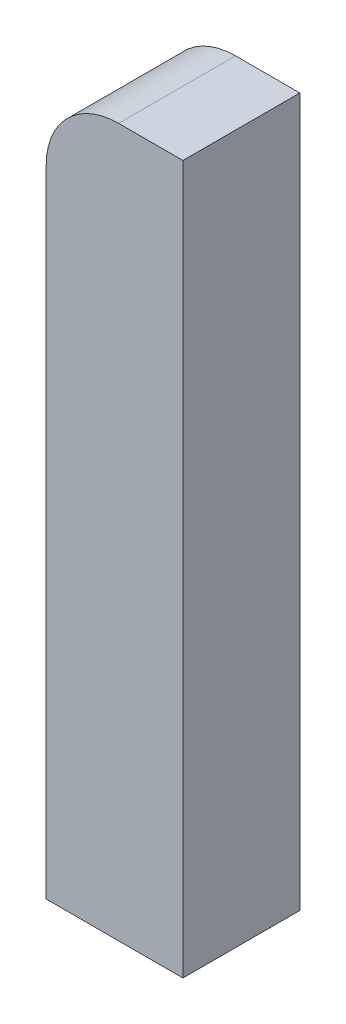
ISO-10303-21;
HEADER;
FILE_DESCRIPTION(('STEP AP214'),'2;1');
FILE_NAME('part.step','',(''),(''),'','','');
FILE_SCHEMA(('AUTOMOTIVE_DESIGN { 1 0 10303 214 1 1 1 1 }'));
ENDSEC;
DATA;
#1=APPLICATION_CONTEXT('core data for automotive mechanical design processes');
#2=APPLICATION_PROTOCOL_DEFINITION('international standard','automotive_design',2000,#1);
#3=PRODUCT_CONTEXT('',#1,'mechanical');
#4=PRODUCT('Part','Part','',(#3));
#5=PRODUCT_RELATED_PRODUCT_CATEGORY('part','',(#4));
#6=PRODUCT_DEFINITION_FORMATION('','',#4);
#7=PRODUCT_DEFINITION_CONTEXT('part definition',#1,'design');
#8=PRODUCT_DEFINITION('design','',#6,#7);
#9=PRODUCT_DEFINITION_SHAPE('','',#8);
#10=(LENGTH_UNIT() NAMED_UNIT(*) SI_UNIT(.MILLI.,.METRE.));
#11=(NAMED_UNIT(*) PLANE_ANGLE_UNIT() SI_UNIT($,.RADIAN.));
#12=(NAMED_UNIT(*) SI_UNIT($,.STERADIAN.) SOLID_ANGLE_UNIT());
#13=UNCERTAINTY_MEASURE_WITH_UNIT(LENGTH_MEASURE(1.E-05),#10,'distance_accuracy_value','');
#14=(GEOMETRIC_REPRESENTATION_CONTEXT(3) GLOBAL_UNCERTAINTY_ASSIGNED_CONTEXT((#13)) GLOBAL_UNIT_ASSIGNED_CONTEXT((#10,
#11,#12)) REPRESENTATION_CONTEXT('',''));
#15=CARTESIAN_POINT('',(0.,0.,0.));
#16=DIRECTION('',(0.,0.,1.));
#17=DIRECTION('',(1.,0.,0.));
#18=AXIS2_PLACEMENT_3D('',#15,#16,#17);
#19=CARTESIAN_POINT('',(0.,0.,16.141));
#20=DIRECTION('',(0.,0.,1.));
#21=DIRECTION('',(1.,0.,0.));
#22=AXIS2_PLACEMENT_3D('',#19,#20,#21);
#23=PLANE('',#22);
#24=DIRECTION('',(-1.,0.,0.));
#25=VECTOR('',#24,1.);
#26=CARTESIAN_POINT('',(28.3125,145.891,16.141));
#27=LINE('',#26,#25);
#28=CARTESIAN_POINT('',(28.3125,145.891,16.141));
#29=VERTEX_POINT('',#28);
#30=CARTESIAN_POINT('',(19.4375,145.891,16.141));
#31=VERTEX_POINT('',#30);
#32=EDGE_CURVE('E122',#29,#31,#27,.T.);
#33=ORIENTED_EDGE('',*,*,#32,.T.);
#34=CARTESIAN_POINT('',(19.4375,135.891,16.141));
#35=DIRECTION('',(0.,0.,1.));
#36=DIRECTION('',(1.,0.,0.));
#37=AXIS2_PLACEMENT_3D('',#34,#35,#36);
#38=CIRCLE('',#37,10.);
#39=CARTESIAN_POINT('',(9.4375,135.891,16.141));
#40=VERTEX_POINT('',#39);
#41=EDGE_CURVE('E11',#31,#40,#38,.T.);
#42=ORIENTED_EDGE('',*,*,#41,.T.);
#43=DIRECTION('',(0.,-1.,0.));
#44=VECTOR('',#43,1.);
#45=CARTESIAN_POINT('',(9.4375,145.891,16.141));
#46=LINE('',#45,#44);
#47=CARTESIAN_POINT('',(9.4375,48.144,16.141));
#48=VERTEX_POINT('',#47);
#49=EDGE_CURVE('E107',#40,#48,#46,.T.);
#50=ORIENTED_EDGE('',*,*,#49,.T.);
#51=DIRECTION('',(-1.,0.,0.));
#52=VECTOR('',#51,1.);
#53=CARTESIAN_POINT('',(9.4375,48.144,16.141));
#54=LINE('',#53,#52);
#55=CARTESIAN_POINT('',(28.3125,48.144,16.141));
#56=VERTEX_POINT('',#55);
#57=EDGE_CURVE('E90',#56,#48,#54,.T.);
#58=ORIENTED_EDGE('',*,*,#57,.F.);
#59=DIRECTION('',(0.,1.,0.));
#60=VECTOR('',#59,1.);
#61=CARTESIAN_POINT('',(28.3125,48.144,16.141));
#62=LINE('',#61,#60);
#63=EDGE_CURVE('E97',#56,#29,#62,.T.);
#64=ORIENTED_EDGE('',*,*,#63,.T.);
#65=EDGE_LOOP('',(#33,#42,#50,#58,#64));
#66=FACE_BOUND('',#65,.T.);
#67=ADVANCED_FACE('F33',(#66),#23,.T.);
#68=CARTESIAN_POINT('',(0.,0.,0.));
#69=DIRECTION('',(0.,0.,1.));
#70=DIRECTION('',(1.,0.,0.));
#71=AXIS2_PLACEMENT_3D('',#68,#69,#70);
#72=PLANE('',#71);
#73=DIRECTION('',(0.,-1.,0.));
#74=VECTOR('',#73,1.);
#75=CARTESIAN_POINT('',(9.4375,145.891,0.));
#76=LINE('',#75,#74);
#77=CARTESIAN_POINT('',(9.4375,135.891,0.));
#78=VERTEX_POINT('',#77);
#79=CARTESIAN_POINT('',(9.4375,48.144,0.));
#80=VERTEX_POINT('',#79);
#81=EDGE_CURVE('E104',#78,#80,#76,.T.);
#82=ORIENTED_EDGE('',*,*,#81,.F.);
#83=CARTESIAN_POINT('',(19.4375,135.891,0.));
#84=DIRECTION('',(0.,0.,1.));
#85=DIRECTION('',(1.,0.,0.));
#86=AXIS2_PLACEMENT_3D('',#83,#84,#85);
#87=CIRCLE('',#86,10.);
#88=CARTESIAN_POINT('',(19.4375,145.891,0.));
#89=VERTEX_POINT('',#88);
#90=EDGE_CURVE('E55',#78,#89,#87,.F.);
#91=ORIENTED_EDGE('',*,*,#90,.T.);
#92=DIRECTION('',(-1.,0.,0.));
#93=VECTOR('',#92,1.);
#94=CARTESIAN_POINT('',(28.3125,145.891,0.));
#95=LINE('',#94,#93);
#96=CARTESIAN_POINT('',(28.3125,145.891,0.));
#97=VERTEX_POINT('',#96);
#98=EDGE_CURVE('E102',#97,#89,#95,.T.);
#99=ORIENTED_EDGE('',*,*,#98,.F.);
#100=DIRECTION('',(0.,1.,0.));
#101=VECTOR('',#100,1.);
#102=CARTESIAN_POINT('',(28.3125,48.144,0.));
#103=LINE('',#102,#101);
#104=CARTESIAN_POINT('',(28.3125,48.144,0.));
#105=VERTEX_POINT('',#104);
#106=EDGE_CURVE('E89',#105,#97,#103,.T.);
#107=ORIENTED_EDGE('',*,*,#106,.F.);
#108=DIRECTION('',(-1.,0.,0.));
#109=VECTOR('',#108,1.);
#110=CARTESIAN_POINT('',(9.4375,48.144,0.));
#111=LINE('',#110,#109);
#112=EDGE_CURVE('E80',#105,#80,#111,.T.);
#113=ORIENTED_EDGE('',*,*,#112,.T.);
#114=EDGE_LOOP('',(#82,#91,#99,#107,#113));
#115=FACE_BOUND('',#114,.T.);
#116=ADVANCED_FACE('F101',(#115),#72,.F.);
#117=CARTESIAN_POINT('',(28.3125,48.144,16.141));
#118=DIRECTION('',(-1.,0.,0.));
#119=DIRECTION('',(0.,0.,1.));
#120=AXIS2_PLACEMENT_3D('',#117,#118,#119);
#121=PLANE('',#120);
#122=ORIENTED_EDGE('',*,*,#106,.T.);
#123=DIRECTION('',(0.,0.,-1.));
#124=VECTOR('',#123,1.);
#125=CARTESIAN_POINT('',(28.3125,145.891,16.141));
#126=LINE('',#125,#124);
#127=EDGE_CURVE('E99',#29,#97,#126,.T.);
#128=ORIENTED_EDGE('',*,*,#127,.F.);
#129=ORIENTED_EDGE('',*,*,#63,.F.);
#130=DIRECTION('',(0.,0.,-1.));
#131=VECTOR('',#130,1.);
#132=CARTESIAN_POINT('',(28.3125,48.144,16.141));
#133=LINE('',#132,#131);
#134=EDGE_CURVE('E84',#56,#105,#133,.T.);
#135=ORIENTED_EDGE('',*,*,#134,.T.);
#136=EDGE_LOOP('',(#122,#128,#129,#135));
#137=FACE_BOUND('',#136,.T.);
#138=ADVANCED_FACE('F94',(#137),#121,.F.);
#139=CARTESIAN_POINT('',(28.3125,145.891,16.141));
#140=DIRECTION('',(0.,-1.,0.));
#141=DIRECTION('',(0.,0.,-1.));
#142=AXIS2_PLACEMENT_3D('',#139,#140,#141);
#143=PLANE('',#142);
#144=ORIENTED_EDGE('',*,*,#98,.T.);
#145=DIRECTION('',(0.,0.,-1.));
#146=VECTOR('',#145,1.);
#147=CARTESIAN_POINT('',(19.4375,145.891,16.141));
#148=LINE('',#147,#146);
#149=EDGE_CURVE('E41',#89,#31,#148,.F.);
#150=ORIENTED_EDGE('',*,*,#149,.T.);
#151=ORIENTED_EDGE('',*,*,#32,.F.);
#152=ORIENTED_EDGE('',*,*,#127,.T.);
#153=EDGE_LOOP('',(#144,#150,#151,#152));
#154=FACE_BOUND('',#153,.T.);
#155=ADVANCED_FACE('F125',(#154),#143,.F.);
#156=CARTESIAN_POINT('',(9.4375,145.891,16.141));
#157=DIRECTION('',(1.,0.,0.));
#158=DIRECTION('',(0.,0.,-1.));
#159=AXIS2_PLACEMENT_3D('',#156,#157,#158);
#160=PLANE('',#159);
#161=ORIENTED_EDGE('',*,*,#49,.F.);
#162=DIRECTION('',(0.,0.,-1.));
#163=VECTOR('',#162,1.);
#164=CARTESIAN_POINT('',(9.4375,135.891,16.141));
#165=LINE('',#164,#163);
#166=EDGE_CURVE('E98',#40,#78,#165,.T.);
#167=ORIENTED_EDGE('',*,*,#166,.T.);
#168=ORIENTED_EDGE('',*,*,#81,.T.);
#169=DIRECTION('',(0.,0.,-1.));
#170=VECTOR('',#169,1.);
#171=CARTESIAN_POINT('',(9.4375,48.144,16.141));
#172=LINE('',#171,#170);
#173=EDGE_CURVE('E87',#48,#80,#172,.T.);
#174=ORIENTED_EDGE('',*,*,#173,.F.);
#175=EDGE_LOOP('',(#161,#167,#168,#174));
#176=FACE_BOUND('',#175,.T.);
#177=ADVANCED_FACE('F118',(#176),#160,.F.);
#178=CARTESIAN_POINT('',(9.4375,48.144,0.));
#179=DIRECTION('',(0.,1.,0.));
#180=DIRECTION('',(0.,0.,1.));
#181=AXIS2_PLACEMENT_3D('',#178,#179,#180);
#182=PLANE('',#181);
#183=ORIENTED_EDGE('',*,*,#57,.T.);
#184=ORIENTED_EDGE('',*,*,#173,.T.);
#185=ORIENTED_EDGE('',*,*,#112,.F.);
#186=ORIENTED_EDGE('',*,*,#134,.F.);
#187=EDGE_LOOP('',(#183,#184,#185,#186));
#188=FACE_BOUND('',#187,.T.);
#189=ADVANCED_FACE('F83',(#188),#182,.F.);
#190=CARTESIAN_POINT('',(19.4375,135.891,16.141));
#191=DIRECTION('',(0.,0.,-1.));
#192=DIRECTION('',(-1.,0.,0.));
#193=AXIS2_PLACEMENT_3D('',#190,#191,#192);
#194=CYLINDRICAL_SURFACE('',#193,10.);
#195=ORIENTED_EDGE('',*,*,#41,.F.);
#196=ORIENTED_EDGE('',*,*,#149,.F.);
#197=ORIENTED_EDGE('',*,*,#90,.F.);
#198=ORIENTED_EDGE('',*,*,#166,.F.);
#199=EDGE_LOOP('',(#195,#196,#197,#198));
#200=FACE_BOUND('',#199,.T.);
#201=ADVANCED_FACE('F35',(#200),#194,.T.);
#202=CLOSED_SHELL('',(#67,#116,#138,#155,#177,#189,#201));
#203=MANIFOLD_SOLID_BREP('B2',#202);
#204=ADVANCED_BREP_SHAPE_REPRESENTATION('',(#18,#203),#14);
#205=SHAPE_DEFINITION_REPRESENTATION(#9,#204);
ENDSEC;
END-ISO-10303-21;
